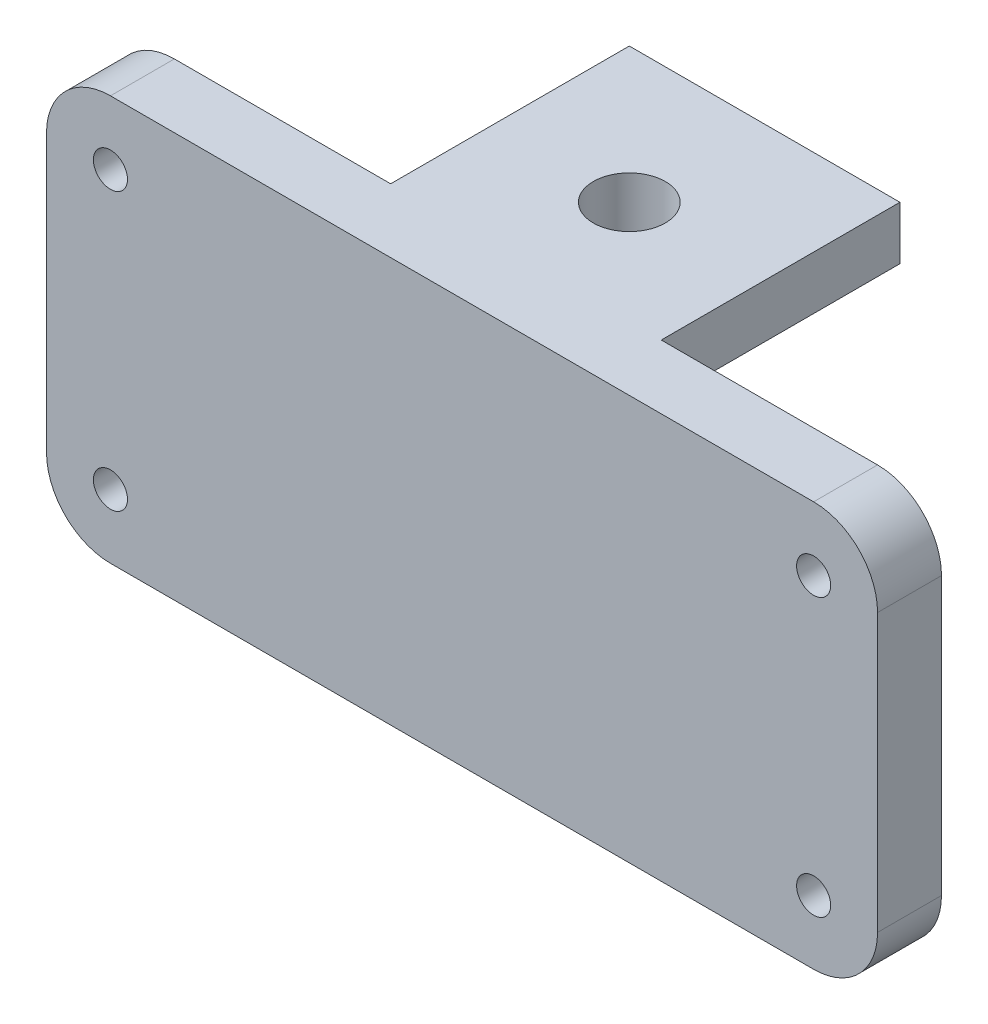
ISO-10303-21;
HEADER;
FILE_DESCRIPTION(('STEP AP214'),'2;1');
FILE_NAME('part.step','',(''),(''),'','','');
FILE_SCHEMA(('AUTOMOTIVE_DESIGN { 1 0 10303 214 1 1 1 1 }'));
ENDSEC;
DATA;
#1=APPLICATION_CONTEXT('core data for automotive mechanical design processes');
#2=APPLICATION_PROTOCOL_DEFINITION('international standard','automotive_design',2000,#1);
#3=PRODUCT_CONTEXT('',#1,'mechanical');
#4=PRODUCT('Part','Part','',(#3));
#5=PRODUCT_RELATED_PRODUCT_CATEGORY('part','',(#4));
#6=PRODUCT_DEFINITION_FORMATION('','',#4);
#7=PRODUCT_DEFINITION_CONTEXT('part definition',#1,'design');
#8=PRODUCT_DEFINITION('design','',#6,#7);
#9=PRODUCT_DEFINITION_SHAPE('','',#8);
#10=(LENGTH_UNIT() NAMED_UNIT(*) SI_UNIT(.MILLI.,.METRE.));
#11=(NAMED_UNIT(*) PLANE_ANGLE_UNIT() SI_UNIT($,.RADIAN.));
#12=(NAMED_UNIT(*) SI_UNIT($,.STERADIAN.) SOLID_ANGLE_UNIT());
#13=UNCERTAINTY_MEASURE_WITH_UNIT(LENGTH_MEASURE(1.E-05),#10,'distance_accuracy_value','');
#14=(GEOMETRIC_REPRESENTATION_CONTEXT(3) GLOBAL_UNCERTAINTY_ASSIGNED_CONTEXT((#13)) GLOBAL_UNIT_ASSIGNED_CONTEXT((#10,
#11,#12)) REPRESENTATION_CONTEXT('',''));
#15=CARTESIAN_POINT('',(0.,0.,0.));
#16=DIRECTION('',(0.,0.,1.));
#17=DIRECTION('',(1.,0.,0.));
#18=AXIS2_PLACEMENT_3D('',#15,#16,#17);
#19=CARTESIAN_POINT('',(12.7,5.,-12.7));
#20=DIRECTION('',(-1.,0.,0.));
#21=DIRECTION('',(0.,0.,1.));
#22=AXIS2_PLACEMENT_3D('',#19,#20,#21);
#23=PLANE('',#22);
#24=DIRECTION('',(0.,1.,0.));
#25=VECTOR('',#24,1.);
#26=CARTESIAN_POINT('',(12.7,5.,9.7));
#27=LINE('',#26,#25);
#28=CARTESIAN_POINT('',(12.7,0.,9.7));
#29=VERTEX_POINT('',#28);
#30=CARTESIAN_POINT('',(12.7,5.,9.7));
#31=VERTEX_POINT('',#30);
#32=EDGE_CURVE('E152',#29,#31,#27,.T.);
#33=ORIENTED_EDGE('',*,*,#32,.F.);
#34=DIRECTION('',(0.,0.,-1.));
#35=VECTOR('',#34,1.);
#36=CARTESIAN_POINT('',(12.7,0.,-12.7));
#37=LINE('',#36,#35);
#38=CARTESIAN_POINT('',(12.7,0.,-12.7));
#39=VERTEX_POINT('',#38);
#40=EDGE_CURVE('E137',#29,#39,#37,.T.);
#41=ORIENTED_EDGE('',*,*,#40,.T.);
#42=DIRECTION('',(0.,-1.,0.));
#43=VECTOR('',#42,1.);
#44=CARTESIAN_POINT('',(12.7,5.,-12.7));
#45=LINE('',#44,#43);
#46=CARTESIAN_POINT('',(12.7,5.,-12.7));
#47=VERTEX_POINT('',#46);
#48=EDGE_CURVE('E166',#47,#39,#45,.T.);
#49=ORIENTED_EDGE('',*,*,#48,.F.);
#50=DIRECTION('',(0.,0.,-1.));
#51=VECTOR('',#50,1.);
#52=CARTESIAN_POINT('',(12.7,5.,-12.7));
#53=LINE('',#52,#51);
#54=EDGE_CURVE('E153',#31,#47,#53,.T.);
#55=ORIENTED_EDGE('',*,*,#54,.F.);
#56=EDGE_LOOP('',(#33,#41,#49,#55));
#57=FACE_BOUND('',#56,.T.);
#58=ADVANCED_FACE('F47',(#57),#23,.F.);
#59=CARTESIAN_POINT('',(-12.7,5.,-12.7));
#60=DIRECTION('',(1.,0.,0.));
#61=DIRECTION('',(0.,0.,-1.));
#62=AXIS2_PLACEMENT_3D('',#59,#60,#61);
#63=PLANE('',#62);
#64=DIRECTION('',(0.,-1.,0.));
#65=VECTOR('',#64,1.);
#66=CARTESIAN_POINT('',(-12.7,5.,9.7));
#67=LINE('',#66,#65);
#68=CARTESIAN_POINT('',(-12.7,5.,9.7));
#69=VERTEX_POINT('',#68);
#70=CARTESIAN_POINT('',(-12.7,0.,9.7));
#71=VERTEX_POINT('',#70);
#72=EDGE_CURVE('E158',#69,#71,#67,.T.);
#73=ORIENTED_EDGE('',*,*,#72,.F.);
#74=DIRECTION('',(0.,0.,1.));
#75=VECTOR('',#74,1.);
#76=CARTESIAN_POINT('',(-12.7,5.,-12.7));
#77=LINE('',#76,#75);
#78=CARTESIAN_POINT('',(-12.7,5.,-12.7));
#79=VERTEX_POINT('',#78);
#80=EDGE_CURVE('E279',#79,#69,#77,.T.);
#81=ORIENTED_EDGE('',*,*,#80,.F.);
#82=DIRECTION('',(0.,-1.,0.));
#83=VECTOR('',#82,1.);
#84=CARTESIAN_POINT('',(-12.7,5.,-12.7));
#85=LINE('',#84,#83);
#86=CARTESIAN_POINT('',(-12.7,0.,-12.7));
#87=VERTEX_POINT('',#86);
#88=EDGE_CURVE('E172',#79,#87,#85,.T.);
#89=ORIENTED_EDGE('',*,*,#88,.T.);
#90=DIRECTION('',(0.,0.,1.));
#91=VECTOR('',#90,1.);
#92=CARTESIAN_POINT('',(-12.7,0.,-12.7));
#93=LINE('',#92,#91);
#94=EDGE_CURVE('E276',#87,#71,#93,.T.);
#95=ORIENTED_EDGE('',*,*,#94,.T.);
#96=EDGE_LOOP('',(#73,#81,#89,#95));
#97=FACE_BOUND('',#96,.T.);
#98=ADVANCED_FACE('F290',(#97),#63,.F.);
#99=CARTESIAN_POINT('',(0.,0.,0.));
#100=DIRECTION('',(0.,1.,0.));
#101=DIRECTION('',(0.,0.,1.));
#102=AXIS2_PLACEMENT_3D('',#99,#100,#101);
#103=PLANE('',#102);
#104=CARTESIAN_POINT('',(0.,0.,0.));
#105=DIRECTION('',(0.,1.,0.));
#106=DIRECTION('',(0.,0.,1.));
#107=AXIS2_PLACEMENT_3D('',#104,#105,#106);
#108=CIRCLE('',#107,3.37819999999999);
#109=CARTESIAN_POINT('',(0.,0.,3.37819999999999));
#110=VERTEX_POINT('',#109);
#111=EDGE_CURVE('E149',#110,#110,#108,.T.);
#112=ORIENTED_EDGE('',*,*,#111,.T.);
#113=EDGE_LOOP('',(#112));
#114=FACE_BOUND('',#113,.T.);
#115=DIRECTION('',(1.,0.,0.));
#116=VECTOR('',#115,1.);
#117=CARTESIAN_POINT('',(0.,0.,9.7));
#118=LINE('',#117,#116);
#119=EDGE_CURVE('E142',#71,#29,#118,.T.);
#120=ORIENTED_EDGE('',*,*,#119,.F.);
#121=ORIENTED_EDGE('',*,*,#94,.F.);
#122=DIRECTION('',(-1.,0.,0.));
#123=VECTOR('',#122,1.);
#124=CARTESIAN_POINT('',(-12.7,0.,-12.7));
#125=LINE('',#124,#123);
#126=EDGE_CURVE('E144',#39,#87,#125,.T.);
#127=ORIENTED_EDGE('',*,*,#126,.F.);
#128=ORIENTED_EDGE('',*,*,#40,.F.);
#129=EDGE_LOOP('',(#120,#121,#127,#128));
#130=FACE_BOUND('',#129,.T.);
#131=ADVANCED_FACE('F139',(#114,#130),#103,.F.);
#132=CARTESIAN_POINT('',(-12.7,5.,-12.7));
#133=DIRECTION('',(0.,0.,1.));
#134=DIRECTION('',(1.,0.,0.));
#135=AXIS2_PLACEMENT_3D('',#132,#133,#134);
#136=PLANE('',#135);
#137=ORIENTED_EDGE('',*,*,#126,.T.);
#138=ORIENTED_EDGE('',*,*,#88,.F.);
#139=DIRECTION('',(-1.,0.,0.));
#140=VECTOR('',#139,1.);
#141=CARTESIAN_POINT('',(-12.7,5.,-12.7));
#142=LINE('',#141,#140);
#143=EDGE_CURVE('E275',#47,#79,#142,.T.);
#144=ORIENTED_EDGE('',*,*,#143,.F.);
#145=ORIENTED_EDGE('',*,*,#48,.T.);
#146=EDGE_LOOP('',(#137,#138,#144,#145));
#147=FACE_BOUND('',#146,.T.);
#148=ADVANCED_FACE('F293',(#147),#136,.F.);
#149=CARTESIAN_POINT('',(0.,5.,0.));
#150=DIRECTION('',(0.,1.,0.));
#151=DIRECTION('',(0.,0.,1.));
#152=AXIS2_PLACEMENT_3D('',#149,#150,#151);
#153=PLANE('',#152);
#154=DIRECTION('',(1.,0.,0.));
#155=VECTOR('',#154,1.);
#156=CARTESIAN_POINT('',(0.,5.,15.7));
#157=LINE('',#156,#155);
#158=CARTESIAN_POINT('',(-33.,5.,15.7));
#159=VERTEX_POINT('',#158);
#160=CARTESIAN_POINT('',(33.,5.,15.7));
#161=VERTEX_POINT('',#160);
#162=EDGE_CURVE('E222',#159,#161,#157,.T.);
#163=ORIENTED_EDGE('',*,*,#162,.T.);
#164=DIRECTION('',(0.,0.,1.));
#165=VECTOR('',#164,1.);
#166=CARTESIAN_POINT('',(33.,5.,0.));
#167=LINE('',#166,#165);
#168=CARTESIAN_POINT('',(33.,5.,9.7));
#169=VERTEX_POINT('',#168);
#170=EDGE_CURVE('E11',#161,#169,#167,.F.);
#171=ORIENTED_EDGE('',*,*,#170,.T.);
#172=DIRECTION('',(1.,0.,0.));
#173=VECTOR('',#172,1.);
#174=CARTESIAN_POINT('',(0.,5.,9.7));
#175=LINE('',#174,#173);
#176=EDGE_CURVE('E264',#31,#169,#175,.T.);
#177=ORIENTED_EDGE('',*,*,#176,.F.);
#178=ORIENTED_EDGE('',*,*,#54,.T.);
#179=ORIENTED_EDGE('',*,*,#143,.T.);
#180=ORIENTED_EDGE('',*,*,#80,.T.);
#181=CARTESIAN_POINT('',(-33.,5.,9.7));
#182=VERTEX_POINT('',#181);
#183=EDGE_CURVE('E225',#182,#69,#175,.T.);
#184=ORIENTED_EDGE('',*,*,#183,.F.);
#185=DIRECTION('',(0.,0.,1.));
#186=VECTOR('',#185,1.);
#187=CARTESIAN_POINT('',(-33.,5.,15.7));
#188=LINE('',#187,#186);
#189=EDGE_CURVE('E56',#182,#159,#188,.T.);
#190=ORIENTED_EDGE('',*,*,#189,.T.);
#191=EDGE_LOOP('',(#163,#171,#177,#178,#179,#180,#184,#190));
#192=FACE_BOUND('',#191,.T.);
#193=CARTESIAN_POINT('',(0.,5.,0.));
#194=DIRECTION('',(0.,1.,0.));
#195=DIRECTION('',(0.,0.,1.));
#196=AXIS2_PLACEMENT_3D('',#193,#194,#195);
#197=CIRCLE('',#196,3.37819999999999);
#198=CARTESIAN_POINT('',(0.,5.,3.37819999999999));
#199=VERTEX_POINT('',#198);
#200=EDGE_CURVE('E157',#199,#199,#197,.T.);
#201=ORIENTED_EDGE('',*,*,#200,.F.);
#202=EDGE_LOOP('',(#201));
#203=FACE_BOUND('',#202,.T.);
#204=ADVANCED_FACE('F220',(#192,#203),#153,.T.);
#205=CARTESIAN_POINT('',(0.,5.,0.));
#206=DIRECTION('',(0.,1.,0.));
#207=DIRECTION('',(0.,0.,1.));
#208=AXIS2_PLACEMENT_3D('',#205,#206,#207);
#209=CYLINDRICAL_SURFACE('',#208,3.37819999999999);
#210=ORIENTED_EDGE('',*,*,#111,.F.);
#211=EDGE_LOOP('',(#210));
#212=FACE_BOUND('',#211,.T.);
#213=ORIENTED_EDGE('',*,*,#200,.T.);
#214=EDGE_LOOP('',(#213));
#215=FACE_BOUND('',#214,.T.);
#216=ADVANCED_FACE('F388',(#212,#215),#209,.F.);
#217=CARTESIAN_POINT('',(0.,0.,9.7));
#218=DIRECTION('',(0.,0.,1.));
#219=DIRECTION('',(1.,0.,0.));
#220=AXIS2_PLACEMENT_3D('',#217,#218,#219);
#221=PLANE('',#220);
#222=CARTESIAN_POINT('',(-33.,-27.,9.7));
#223=DIRECTION('',(0.,0.,1.));
#224=DIRECTION('',(1.,0.,0.));
#225=AXIS2_PLACEMENT_3D('',#222,#223,#224);
#226=CIRCLE('',#225,1.6);
#227=CARTESIAN_POINT('',(-31.4,-27.,9.7));
#228=VERTEX_POINT('',#227);
#229=EDGE_CURVE('E310',#228,#228,#226,.T.);
#230=ORIENTED_EDGE('',*,*,#229,.T.);
#231=EDGE_LOOP('',(#230));
#232=FACE_BOUND('',#231,.T.);
#233=CARTESIAN_POINT('',(33.,-27.,9.7));
#234=DIRECTION('',(0.,0.,1.));
#235=DIRECTION('',(1.,0.,0.));
#236=AXIS2_PLACEMENT_3D('',#233,#234,#235);
#237=CIRCLE('',#236,1.6);
#238=CARTESIAN_POINT('',(34.6,-27.,9.7));
#239=VERTEX_POINT('',#238);
#240=EDGE_CURVE('E314',#239,#239,#237,.T.);
#241=ORIENTED_EDGE('',*,*,#240,.T.);
#242=EDGE_LOOP('',(#241));
#243=FACE_BOUND('',#242,.T.);
#244=CARTESIAN_POINT('',(33.,-1.,9.7));
#245=DIRECTION('',(0.,0.,1.));
#246=DIRECTION('',(1.,0.,0.));
#247=AXIS2_PLACEMENT_3D('',#244,#245,#246);
#248=CIRCLE('',#247,1.6);
#249=CARTESIAN_POINT('',(34.6,-1.,9.7));
#250=VERTEX_POINT('',#249);
#251=EDGE_CURVE('E317',#250,#250,#248,.T.);
#252=ORIENTED_EDGE('',*,*,#251,.T.);
#253=EDGE_LOOP('',(#252));
#254=FACE_BOUND('',#253,.T.);
#255=CARTESIAN_POINT('',(-33.,-1.,9.7));
#256=DIRECTION('',(0.,0.,1.));
#257=DIRECTION('',(1.,0.,0.));
#258=AXIS2_PLACEMENT_3D('',#255,#256,#257);
#259=CIRCLE('',#258,1.6);
#260=CARTESIAN_POINT('',(-31.4,-1.,9.7));
#261=VERTEX_POINT('',#260);
#262=EDGE_CURVE('E240',#261,#261,#259,.T.);
#263=ORIENTED_EDGE('',*,*,#262,.T.);
#264=EDGE_LOOP('',(#263));
#265=FACE_BOUND('',#264,.T.);
#266=DIRECTION('',(0.,1.,0.));
#267=VECTOR('',#266,1.);
#268=CARTESIAN_POINT('',(39.,0.,9.7));
#269=LINE('',#268,#267);
#270=CARTESIAN_POINT('',(39.,-27.,9.7));
#271=VERTEX_POINT('',#270);
#272=CARTESIAN_POINT('',(39.,-1.,9.7));
#273=VERTEX_POINT('',#272);
#274=EDGE_CURVE('E306',#271,#273,#269,.T.);
#275=ORIENTED_EDGE('',*,*,#274,.F.);
#276=CARTESIAN_POINT('',(33.,-27.,9.7));
#277=DIRECTION('',(0.,0.,1.));
#278=DIRECTION('',(1.,0.,0.));
#279=AXIS2_PLACEMENT_3D('',#276,#277,#278);
#280=CIRCLE('',#279,6.);
#281=CARTESIAN_POINT('',(33.,-33.,9.7));
#282=VERTEX_POINT('',#281);
#283=EDGE_CURVE('E206',#271,#282,#280,.F.);
#284=ORIENTED_EDGE('',*,*,#283,.T.);
#285=DIRECTION('',(1.,0.,0.));
#286=VECTOR('',#285,1.);
#287=CARTESIAN_POINT('',(0.,-33.,9.7));
#288=LINE('',#287,#286);
#289=CARTESIAN_POINT('',(-33.,-33.,9.7));
#290=VERTEX_POINT('',#289);
#291=EDGE_CURVE('E302',#290,#282,#288,.T.);
#292=ORIENTED_EDGE('',*,*,#291,.F.);
#293=CARTESIAN_POINT('',(-33.,-27.,9.7));
#294=DIRECTION('',(0.,0.,1.));
#295=DIRECTION('',(1.,0.,0.));
#296=AXIS2_PLACEMENT_3D('',#293,#294,#295);
#297=CIRCLE('',#296,6.);
#298=CARTESIAN_POINT('',(-39.,-27.,9.7));
#299=VERTEX_POINT('',#298);
#300=EDGE_CURVE('E203',#290,#299,#297,.F.);
#301=ORIENTED_EDGE('',*,*,#300,.T.);
#302=DIRECTION('',(0.,1.,0.));
#303=VECTOR('',#302,1.);
#304=CARTESIAN_POINT('',(-39.,0.,9.7));
#305=LINE('',#304,#303);
#306=CARTESIAN_POINT('',(-39.,-1.,9.7));
#307=VERTEX_POINT('',#306);
#308=EDGE_CURVE('E298',#299,#307,#305,.T.);
#309=ORIENTED_EDGE('',*,*,#308,.T.);
#310=CARTESIAN_POINT('',(-33.,-1.,9.7));
#311=DIRECTION('',(0.,0.,1.));
#312=DIRECTION('',(1.,0.,0.));
#313=AXIS2_PLACEMENT_3D('',#310,#311,#312);
#314=CIRCLE('',#313,6.);
#315=EDGE_CURVE('E63',#307,#182,#314,.F.);
#316=ORIENTED_EDGE('',*,*,#315,.T.);
#317=ORIENTED_EDGE('',*,*,#183,.T.);
#318=ORIENTED_EDGE('',*,*,#72,.T.);
#319=ORIENTED_EDGE('',*,*,#119,.T.);
#320=ORIENTED_EDGE('',*,*,#32,.T.);
#321=ORIENTED_EDGE('',*,*,#176,.T.);
#322=CARTESIAN_POINT('',(33.,-1.,9.7));
#323=DIRECTION('',(0.,0.,1.));
#324=DIRECTION('',(1.,0.,0.));
#325=AXIS2_PLACEMENT_3D('',#322,#323,#324);
#326=CIRCLE('',#325,6.);
#327=EDGE_CURVE('E200',#169,#273,#326,.F.);
#328=ORIENTED_EDGE('',*,*,#327,.T.);
#329=EDGE_LOOP('',(#275,#284,#292,#301,#309,#316,#317,#318,#319,#320,#321,#328));
#330=FACE_BOUND('',#329,.T.);
#331=ADVANCED_FACE('F162',(#232,#243,#254,#265,#330),#221,.F.);
#332=CARTESIAN_POINT('',(39.,0.,9.7));
#333=DIRECTION('',(1.,0.,0.));
#334=DIRECTION('',(0.,1.,0.));
#335=AXIS2_PLACEMENT_3D('',#332,#333,#334);
#336=PLANE('',#335);
#337=DIRECTION('',(0.,1.,0.));
#338=VECTOR('',#337,1.);
#339=CARTESIAN_POINT('',(39.,0.,15.7));
#340=LINE('',#339,#338);
#341=CARTESIAN_POINT('',(39.,-27.,15.7));
#342=VERTEX_POINT('',#341);
#343=CARTESIAN_POINT('',(39.,-1.,15.7));
#344=VERTEX_POINT('',#343);
#345=EDGE_CURVE('E245',#342,#344,#340,.T.);
#346=ORIENTED_EDGE('',*,*,#345,.F.);
#347=DIRECTION('',(0.,0.,1.));
#348=VECTOR('',#347,1.);
#349=CARTESIAN_POINT('',(39.,-27.,9.7));
#350=LINE('',#349,#348);
#351=EDGE_CURVE('E195',#342,#271,#350,.F.);
#352=ORIENTED_EDGE('',*,*,#351,.T.);
#353=ORIENTED_EDGE('',*,*,#274,.T.);
#354=DIRECTION('',(0.,0.,1.));
#355=VECTOR('',#354,1.);
#356=CARTESIAN_POINT('',(39.,-1.,9.7));
#357=LINE('',#356,#355);
#358=EDGE_CURVE('E191',#273,#344,#357,.T.);
#359=ORIENTED_EDGE('',*,*,#358,.T.);
#360=EDGE_LOOP('',(#346,#352,#353,#359));
#361=FACE_BOUND('',#360,.T.);
#362=ADVANCED_FACE('F366',(#361),#336,.T.);
#363=CARTESIAN_POINT('',(0.,-33.,9.7));
#364=DIRECTION('',(0.,-1.,0.));
#365=DIRECTION('',(0.,0.,-1.));
#366=AXIS2_PLACEMENT_3D('',#363,#364,#365);
#367=PLANE('',#366);
#368=ORIENTED_EDGE('',*,*,#291,.T.);
#369=DIRECTION('',(0.,0.,1.));
#370=VECTOR('',#369,1.);
#371=CARTESIAN_POINT('',(33.,-33.,9.7));
#372=LINE('',#371,#370);
#373=CARTESIAN_POINT('',(33.,-33.,15.7));
#374=VERTEX_POINT('',#373);
#375=EDGE_CURVE('E170',#282,#374,#372,.T.);
#376=ORIENTED_EDGE('',*,*,#375,.T.);
#377=DIRECTION('',(1.,0.,0.));
#378=VECTOR('',#377,1.);
#379=CARTESIAN_POINT('',(0.,-33.,15.7));
#380=LINE('',#379,#378);
#381=CARTESIAN_POINT('',(-33.,-33.,15.7));
#382=VERTEX_POINT('',#381);
#383=EDGE_CURVE('E237',#382,#374,#380,.T.);
#384=ORIENTED_EDGE('',*,*,#383,.F.);
#385=DIRECTION('',(0.,0.,1.));
#386=VECTOR('',#385,1.);
#387=CARTESIAN_POINT('',(-33.,-33.,9.7));
#388=LINE('',#387,#386);
#389=EDGE_CURVE('E165',#382,#290,#388,.F.);
#390=ORIENTED_EDGE('',*,*,#389,.T.);
#391=EDGE_LOOP('',(#368,#376,#384,#390));
#392=FACE_BOUND('',#391,.T.);
#393=ADVANCED_FACE('F372',(#392),#367,.T.);
#394=CARTESIAN_POINT('',(33.,-1.,9.7));
#395=DIRECTION('',(0.,0.,1.));
#396=DIRECTION('',(1.,0.,0.));
#397=AXIS2_PLACEMENT_3D('',#394,#395,#396);
#398=CYLINDRICAL_SURFACE('',#397,1.6);
#399=ORIENTED_EDGE('',*,*,#251,.F.);
#400=EDGE_LOOP('',(#399));
#401=FACE_BOUND('',#400,.T.);
#402=CARTESIAN_POINT('',(33.,-1.,15.7));
#403=DIRECTION('',(0.,0.,1.));
#404=DIRECTION('',(1.,0.,0.));
#405=AXIS2_PLACEMENT_3D('',#402,#403,#404);
#406=CIRCLE('',#405,1.6);
#407=CARTESIAN_POINT('',(34.6,-1.,15.7));
#408=VERTEX_POINT('',#407);
#409=EDGE_CURVE('E256',#408,#408,#406,.T.);
#410=ORIENTED_EDGE('',*,*,#409,.T.);
#411=EDGE_LOOP('',(#410));
#412=FACE_BOUND('',#411,.T.);
#413=ADVANCED_FACE('F460',(#401,#412),#398,.F.);
#414=CARTESIAN_POINT('',(33.,-27.,9.7));
#415=DIRECTION('',(0.,0.,1.));
#416=DIRECTION('',(1.,0.,0.));
#417=AXIS2_PLACEMENT_3D('',#414,#415,#416);
#418=CYLINDRICAL_SURFACE('',#417,1.6);
#419=ORIENTED_EDGE('',*,*,#240,.F.);
#420=EDGE_LOOP('',(#419));
#421=FACE_BOUND('',#420,.T.);
#422=CARTESIAN_POINT('',(33.,-27.,15.7));
#423=DIRECTION('',(0.,0.,1.));
#424=DIRECTION('',(1.,0.,0.));
#425=AXIS2_PLACEMENT_3D('',#422,#423,#424);
#426=CIRCLE('',#425,1.6);
#427=CARTESIAN_POINT('',(34.6,-27.,15.7));
#428=VERTEX_POINT('',#427);
#429=EDGE_CURVE('E252',#428,#428,#426,.T.);
#430=ORIENTED_EDGE('',*,*,#429,.T.);
#431=EDGE_LOOP('',(#430));
#432=FACE_BOUND('',#431,.T.);
#433=ADVANCED_FACE('F382',(#421,#432),#418,.F.);
#434=CARTESIAN_POINT('',(-33.,-27.,9.7));
#435=DIRECTION('',(0.,0.,1.));
#436=DIRECTION('',(1.,0.,0.));
#437=AXIS2_PLACEMENT_3D('',#434,#435,#436);
#438=CYLINDRICAL_SURFACE('',#437,1.6);
#439=ORIENTED_EDGE('',*,*,#229,.F.);
#440=EDGE_LOOP('',(#439));
#441=FACE_BOUND('',#440,.T.);
#442=CARTESIAN_POINT('',(-33.,-27.,15.7));
#443=DIRECTION('',(0.,0.,1.));
#444=DIRECTION('',(1.,0.,0.));
#445=AXIS2_PLACEMENT_3D('',#442,#443,#444);
#446=CIRCLE('',#445,1.6);
#447=CARTESIAN_POINT('',(-31.4,-27.,15.7));
#448=VERTEX_POINT('',#447);
#449=EDGE_CURVE('E248',#448,#448,#446,.T.);
#450=ORIENTED_EDGE('',*,*,#449,.T.);
#451=EDGE_LOOP('',(#450));
#452=FACE_BOUND('',#451,.T.);
#453=ADVANCED_FACE('F376',(#441,#452),#438,.F.);
#454=CARTESIAN_POINT('',(-39.,0.,9.7));
#455=DIRECTION('',(1.,0.,0.));
#456=DIRECTION('',(0.,0.,-1.));
#457=AXIS2_PLACEMENT_3D('',#454,#455,#456);
#458=PLANE('',#457);
#459=ORIENTED_EDGE('',*,*,#308,.F.);
#460=DIRECTION('',(0.,0.,1.));
#461=VECTOR('',#460,1.);
#462=CARTESIAN_POINT('',(-39.,-27.,15.7));
#463=LINE('',#462,#461);
#464=CARTESIAN_POINT('',(-39.,-27.,15.7));
#465=VERTEX_POINT('',#464);
#466=EDGE_CURVE('E211',#299,#465,#463,.T.);
#467=ORIENTED_EDGE('',*,*,#466,.T.);
#468=DIRECTION('',(0.,1.,0.));
#469=VECTOR('',#468,1.);
#470=CARTESIAN_POINT('',(-39.,0.,15.7));
#471=LINE('',#470,#469);
#472=CARTESIAN_POINT('',(-39.,-1.,15.7));
#473=VERTEX_POINT('',#472);
#474=EDGE_CURVE('E234',#465,#473,#471,.T.);
#475=ORIENTED_EDGE('',*,*,#474,.T.);
#476=DIRECTION('',(0.,0.,1.));
#477=VECTOR('',#476,1.);
#478=CARTESIAN_POINT('',(-39.,-1.,9.7));
#479=LINE('',#478,#477);
#480=EDGE_CURVE('E71',#473,#307,#479,.F.);
#481=ORIENTED_EDGE('',*,*,#480,.T.);
#482=EDGE_LOOP('',(#459,#467,#475,#481));
#483=FACE_BOUND('',#482,.T.);
#484=ADVANCED_FACE('F330',(#483),#458,.F.);
#485=CARTESIAN_POINT('',(-33.,-1.,9.7));
#486=DIRECTION('',(0.,0.,1.));
#487=DIRECTION('',(1.,0.,0.));
#488=AXIS2_PLACEMENT_3D('',#485,#486,#487);
#489=CYLINDRICAL_SURFACE('',#488,1.6);
#490=ORIENTED_EDGE('',*,*,#262,.F.);
#491=EDGE_LOOP('',(#490));
#492=FACE_BOUND('',#491,.T.);
#493=CARTESIAN_POINT('',(-33.,-1.,15.7));
#494=DIRECTION('',(0.,0.,1.));
#495=DIRECTION('',(1.,0.,0.));
#496=AXIS2_PLACEMENT_3D('',#493,#494,#495);
#497=CIRCLE('',#496,1.6);
#498=CARTESIAN_POINT('',(-31.4,-1.,15.7));
#499=VERTEX_POINT('',#498);
#500=EDGE_CURVE('E260',#499,#499,#497,.T.);
#501=ORIENTED_EDGE('',*,*,#500,.T.);
#502=EDGE_LOOP('',(#501));
#503=FACE_BOUND('',#502,.T.);
#504=ADVANCED_FACE('F327',(#492,#503),#489,.F.);
#505=CARTESIAN_POINT('',(0.,0.,15.7));
#506=DIRECTION('',(0.,0.,1.));
#507=DIRECTION('',(1.,0.,0.));
#508=AXIS2_PLACEMENT_3D('',#505,#506,#507);
#509=PLANE('',#508);
#510=ORIENTED_EDGE('',*,*,#383,.T.);
#511=CARTESIAN_POINT('',(33.,-27.,15.7));
#512=DIRECTION('',(0.,0.,1.));
#513=DIRECTION('',(1.,0.,0.));
#514=AXIS2_PLACEMENT_3D('',#511,#512,#513);
#515=CIRCLE('',#514,6.);
#516=EDGE_CURVE('E188',#374,#342,#515,.T.);
#517=ORIENTED_EDGE('',*,*,#516,.T.);
#518=ORIENTED_EDGE('',*,*,#345,.T.);
#519=CARTESIAN_POINT('',(33.,-1.,15.7));
#520=DIRECTION('',(0.,0.,1.));
#521=DIRECTION('',(1.,0.,0.));
#522=AXIS2_PLACEMENT_3D('',#519,#520,#521);
#523=CIRCLE('',#522,6.);
#524=EDGE_CURVE('E182',#344,#161,#523,.T.);
#525=ORIENTED_EDGE('',*,*,#524,.T.);
#526=ORIENTED_EDGE('',*,*,#162,.F.);
#527=CARTESIAN_POINT('',(-33.,-1.,15.7));
#528=DIRECTION('',(0.,0.,1.));
#529=DIRECTION('',(1.,0.,0.));
#530=AXIS2_PLACEMENT_3D('',#527,#528,#529);
#531=CIRCLE('',#530,6.);
#532=EDGE_CURVE('E179',#159,#473,#531,.T.);
#533=ORIENTED_EDGE('',*,*,#532,.T.);
#534=ORIENTED_EDGE('',*,*,#474,.F.);
#535=CARTESIAN_POINT('',(-33.,-27.,15.7));
#536=DIRECTION('',(0.,0.,1.));
#537=DIRECTION('',(1.,0.,0.));
#538=AXIS2_PLACEMENT_3D('',#535,#536,#537);
#539=CIRCLE('',#538,6.);
#540=EDGE_CURVE('E185',#465,#382,#539,.T.);
#541=ORIENTED_EDGE('',*,*,#540,.T.);
#542=EDGE_LOOP('',(#510,#517,#518,#525,#526,#533,#534,#541));
#543=FACE_BOUND('',#542,.T.);
#544=ORIENTED_EDGE('',*,*,#449,.F.);
#545=EDGE_LOOP('',(#544));
#546=FACE_BOUND('',#545,.T.);
#547=ORIENTED_EDGE('',*,*,#429,.F.);
#548=EDGE_LOOP('',(#547));
#549=FACE_BOUND('',#548,.T.);
#550=ORIENTED_EDGE('',*,*,#409,.F.);
#551=EDGE_LOOP('',(#550));
#552=FACE_BOUND('',#551,.T.);
#553=ORIENTED_EDGE('',*,*,#500,.F.);
#554=EDGE_LOOP('',(#553));
#555=FACE_BOUND('',#554,.T.);
#556=ADVANCED_FACE('F229',(#543,#546,#549,#552,#555),#509,.T.);
#557=CARTESIAN_POINT('',(33.,-27.,9.7));
#558=DIRECTION('',(0.,0.,1.));
#559=DIRECTION('',(1.,0.,0.));
#560=AXIS2_PLACEMENT_3D('',#557,#558,#559);
#561=CYLINDRICAL_SURFACE('',#560,6.);
#562=ORIENTED_EDGE('',*,*,#283,.F.);
#563=ORIENTED_EDGE('',*,*,#351,.F.);
#564=ORIENTED_EDGE('',*,*,#516,.F.);
#565=ORIENTED_EDGE('',*,*,#375,.F.);
#566=EDGE_LOOP('',(#562,#563,#564,#565));
#567=FACE_BOUND('',#566,.T.);
#568=ADVANCED_FACE('F335',(#567),#561,.T.);
#569=CARTESIAN_POINT('',(-33.,-27.,9.7));
#570=DIRECTION('',(0.,0.,-1.));
#571=DIRECTION('',(-1.,0.,0.));
#572=AXIS2_PLACEMENT_3D('',#569,#570,#571);
#573=CYLINDRICAL_SURFACE('',#572,6.);
#574=ORIENTED_EDGE('',*,*,#300,.F.);
#575=ORIENTED_EDGE('',*,*,#389,.F.);
#576=ORIENTED_EDGE('',*,*,#540,.F.);
#577=ORIENTED_EDGE('',*,*,#466,.F.);
#578=EDGE_LOOP('',(#574,#575,#576,#577));
#579=FACE_BOUND('',#578,.T.);
#580=ADVANCED_FACE('F341',(#579),#573,.T.);
#581=CARTESIAN_POINT('',(33.,-1.,9.7));
#582=DIRECTION('',(0.,0.,1.));
#583=DIRECTION('',(1.,0.,0.));
#584=AXIS2_PLACEMENT_3D('',#581,#582,#583);
#585=CYLINDRICAL_SURFACE('',#584,6.);
#586=ORIENTED_EDGE('',*,*,#327,.F.);
#587=ORIENTED_EDGE('',*,*,#170,.F.);
#588=ORIENTED_EDGE('',*,*,#524,.F.);
#589=ORIENTED_EDGE('',*,*,#358,.F.);
#590=EDGE_LOOP('',(#586,#587,#588,#589));
#591=FACE_BOUND('',#590,.T.);
#592=ADVANCED_FACE('F355',(#591),#585,.T.);
#593=CARTESIAN_POINT('',(-33.,-1.,0.));
#594=DIRECTION('',(0.,0.,-1.));
#595=DIRECTION('',(-1.,0.,0.));
#596=AXIS2_PLACEMENT_3D('',#593,#594,#595);
#597=CYLINDRICAL_SURFACE('',#596,6.);
#598=ORIENTED_EDGE('',*,*,#315,.F.);
#599=ORIENTED_EDGE('',*,*,#480,.F.);
#600=ORIENTED_EDGE('',*,*,#532,.F.);
#601=ORIENTED_EDGE('',*,*,#189,.F.);
#602=EDGE_LOOP('',(#598,#599,#600,#601));
#603=FACE_BOUND('',#602,.T.);
#604=ADVANCED_FACE('F49',(#603),#597,.T.);
#605=CLOSED_SHELL('',(#58,#98,#131,#148,#204,#216,#331,#362,#393,#413,#433,#453,#484,#504,#556,
#568,#580,#592,#604));
#606=MANIFOLD_SOLID_BREP('B2',#605);
#607=ADVANCED_BREP_SHAPE_REPRESENTATION('',(#18,#606),#14);
#608=SHAPE_DEFINITION_REPRESENTATION(#9,#607);
ENDSEC;
END-ISO-10303-21;
